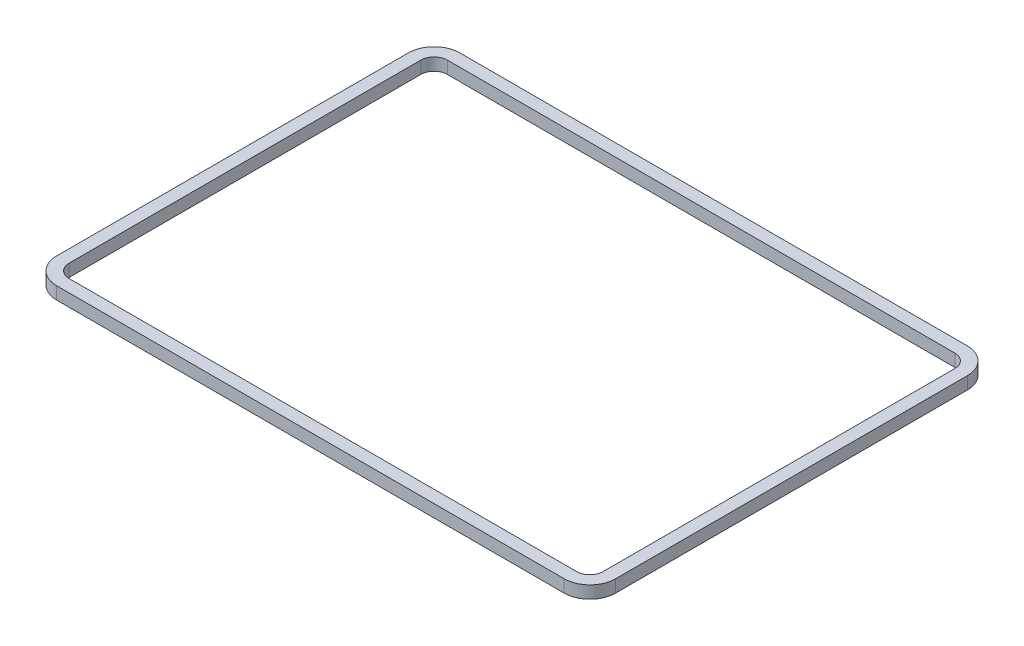
ISO-10303-21;
HEADER;
FILE_DESCRIPTION(('STEP AP214'),'2;1');
FILE_NAME('part.step','',(''),(''),'','','');
FILE_SCHEMA(('AUTOMOTIVE_DESIGN { 1 0 10303 214 1 1 1 1 }'));
ENDSEC;
DATA;
#1=APPLICATION_CONTEXT('core data for automotive mechanical design processes');
#2=APPLICATION_PROTOCOL_DEFINITION('international standard','automotive_design',2000,#1);
#3=PRODUCT_CONTEXT('',#1,'mechanical');
#4=PRODUCT('Part','Part','',(#3));
#5=PRODUCT_RELATED_PRODUCT_CATEGORY('part','',(#4));
#6=PRODUCT_DEFINITION_FORMATION('','',#4);
#7=PRODUCT_DEFINITION_CONTEXT('part definition',#1,'design');
#8=PRODUCT_DEFINITION('design','',#6,#7);
#9=PRODUCT_DEFINITION_SHAPE('','',#8);
#10=(LENGTH_UNIT() NAMED_UNIT(*) SI_UNIT(.MILLI.,.METRE.));
#11=(NAMED_UNIT(*) PLANE_ANGLE_UNIT() SI_UNIT($,.RADIAN.));
#12=(NAMED_UNIT(*) SI_UNIT($,.STERADIAN.) SOLID_ANGLE_UNIT());
#13=UNCERTAINTY_MEASURE_WITH_UNIT(LENGTH_MEASURE(1.E-05),#10,'distance_accuracy_value','');
#14=(GEOMETRIC_REPRESENTATION_CONTEXT(3) GLOBAL_UNCERTAINTY_ASSIGNED_CONTEXT((#13)) GLOBAL_UNIT_ASSIGNED_CONTEXT((#10,
#11,#12)) REPRESENTATION_CONTEXT('',''));
#15=CARTESIAN_POINT('',(0.,0.,0.));
#16=DIRECTION('',(0.,0.,1.));
#17=DIRECTION('',(1.,0.,0.));
#18=AXIS2_PLACEMENT_3D('',#15,#16,#17);
#19=CARTESIAN_POINT('',(-113.919,5.08,82.169));
#20=DIRECTION('',(0.,1.,0.));
#21=DIRECTION('',(0.,0.,1.));
#22=AXIS2_PLACEMENT_3D('',#19,#20,#21);
#23=PLANE('',#22);
#24=DIRECTION('',(-1.,0.,0.));
#25=VECTOR('',#24,1.);
#26=CARTESIAN_POINT('',(-113.919,5.08,-82.169));
#27=LINE('',#26,#25);
#28=CARTESIAN_POINT('',(103.4288,5.08,-82.169));
#29=VERTEX_POINT('',#28);
#30=CARTESIAN_POINT('',(-103.4288,5.08,-82.169));
#31=VERTEX_POINT('',#30);
#32=EDGE_CURVE('E172',#29,#31,#27,.T.);
#33=ORIENTED_EDGE('',*,*,#32,.T.);
#34=CARTESIAN_POINT('',(-103.4288,5.08,-71.6788));
#35=DIRECTION('',(0.,1.,0.));
#36=DIRECTION('',(0.,0.,1.));
#37=AXIS2_PLACEMENT_3D('',#34,#35,#36);
#38=CIRCLE('',#37,10.4902);
#39=CARTESIAN_POINT('',(-113.919,5.08,-71.6788));
#40=VERTEX_POINT('',#39);
#41=EDGE_CURVE('E229',#31,#40,#38,.T.);
#42=ORIENTED_EDGE('',*,*,#41,.T.);
#43=DIRECTION('',(0.,0.,1.));
#44=VECTOR('',#43,1.);
#45=CARTESIAN_POINT('',(-113.919,5.08,-82.169));
#46=LINE('',#45,#44);
#47=CARTESIAN_POINT('',(-113.919,5.08,71.6788));
#48=VERTEX_POINT('',#47);
#49=EDGE_CURVE('E261',#40,#48,#46,.T.);
#50=ORIENTED_EDGE('',*,*,#49,.T.);
#51=CARTESIAN_POINT('',(-103.4288,5.08,71.6788));
#52=DIRECTION('',(0.,1.,0.));
#53=DIRECTION('',(0.,0.,1.));
#54=AXIS2_PLACEMENT_3D('',#51,#52,#53);
#55=CIRCLE('',#54,10.4902);
#56=CARTESIAN_POINT('',(-103.4288,5.08,82.169));
#57=VERTEX_POINT('',#56);
#58=EDGE_CURVE('E227',#48,#57,#55,.T.);
#59=ORIENTED_EDGE('',*,*,#58,.T.);
#60=DIRECTION('',(1.,0.,0.));
#61=VECTOR('',#60,1.);
#62=CARTESIAN_POINT('',(-113.919,5.08,82.169));
#63=LINE('',#62,#61);
#64=CARTESIAN_POINT('',(103.4288,5.08,82.169));
#65=VERTEX_POINT('',#64);
#66=EDGE_CURVE('E243',#57,#65,#63,.T.);
#67=ORIENTED_EDGE('',*,*,#66,.T.);
#68=CARTESIAN_POINT('',(103.4288,5.08,71.6788));
#69=DIRECTION('',(0.,1.,0.));
#70=DIRECTION('',(0.,0.,1.));
#71=AXIS2_PLACEMENT_3D('',#68,#69,#70);
#72=CIRCLE('',#71,10.4902);
#73=CARTESIAN_POINT('',(113.919,5.08,71.6788));
#74=VERTEX_POINT('',#73);
#75=EDGE_CURVE('E53',#65,#74,#72,.T.);
#76=ORIENTED_EDGE('',*,*,#75,.T.);
#77=DIRECTION('',(0.,0.,-1.));
#78=VECTOR('',#77,1.);
#79=CARTESIAN_POINT('',(113.919,5.08,-82.169));
#80=LINE('',#79,#78);
#81=CARTESIAN_POINT('',(113.919,5.08,-71.6788));
#82=VERTEX_POINT('',#81);
#83=EDGE_CURVE('E177',#74,#82,#80,.T.);
#84=ORIENTED_EDGE('',*,*,#83,.T.);
#85=CARTESIAN_POINT('',(103.4288,5.08,-71.6788));
#86=DIRECTION('',(0.,1.,0.));
#87=DIRECTION('',(0.,0.,1.));
#88=AXIS2_PLACEMENT_3D('',#85,#86,#87);
#89=CIRCLE('',#88,10.4902);
#90=EDGE_CURVE('E224',#82,#29,#89,.T.);
#91=ORIENTED_EDGE('',*,*,#90,.T.);
#92=EDGE_LOOP('',(#33,#42,#50,#59,#67,#76,#84,#91));
#93=FACE_BOUND('',#92,.T.);
#94=DIRECTION('',(1.,0.,0.));
#95=VECTOR('',#94,1.);
#96=CARTESIAN_POINT('',(-108.839,5.08,77.089));
#97=LINE('',#96,#95);
#98=CARTESIAN_POINT('',(-103.4288,5.08,77.089));
#99=VERTEX_POINT('',#98);
#100=CARTESIAN_POINT('',(103.4288,5.08,77.089));
#101=VERTEX_POINT('',#100);
#102=EDGE_CURVE('E448',#99,#101,#97,.T.);
#103=ORIENTED_EDGE('',*,*,#102,.F.);
#104=CARTESIAN_POINT('',(-103.4288,5.08,71.6788));
#105=DIRECTION('',(0.,1.,0.));
#106=DIRECTION('',(0.,0.,1.));
#107=AXIS2_PLACEMENT_3D('',#104,#105,#106);
#108=CIRCLE('',#107,5.4102);
#109=CARTESIAN_POINT('',(-108.839,5.08,71.6788));
#110=VERTEX_POINT('',#109);
#111=EDGE_CURVE('E200',#99,#110,#108,.F.);
#112=ORIENTED_EDGE('',*,*,#111,.T.);
#113=DIRECTION('',(0.,0.,1.));
#114=VECTOR('',#113,1.);
#115=CARTESIAN_POINT('',(-108.839,5.08,-77.089));
#116=LINE('',#115,#114);
#117=CARTESIAN_POINT('',(-108.839,5.08,-71.6788));
#118=VERTEX_POINT('',#117);
#119=EDGE_CURVE('E442',#118,#110,#116,.T.);
#120=ORIENTED_EDGE('',*,*,#119,.F.);
#121=CARTESIAN_POINT('',(-103.4288,5.08,-71.6788));
#122=DIRECTION('',(0.,1.,0.));
#123=DIRECTION('',(0.,0.,1.));
#124=AXIS2_PLACEMENT_3D('',#121,#122,#123);
#125=CIRCLE('',#124,5.4102);
#126=CARTESIAN_POINT('',(-103.4288,5.08,-77.089));
#127=VERTEX_POINT('',#126);
#128=EDGE_CURVE('E204',#118,#127,#125,.F.);
#129=ORIENTED_EDGE('',*,*,#128,.T.);
#130=DIRECTION('',(-1.,0.,0.));
#131=VECTOR('',#130,1.);
#132=CARTESIAN_POINT('',(-108.839,5.08,-77.089));
#133=LINE('',#132,#131);
#134=CARTESIAN_POINT('',(103.4288,5.08,-77.089));
#135=VERTEX_POINT('',#134);
#136=EDGE_CURVE('E255',#135,#127,#133,.T.);
#137=ORIENTED_EDGE('',*,*,#136,.F.);
#138=CARTESIAN_POINT('',(103.4288,5.08,-71.6788));
#139=DIRECTION('',(0.,1.,0.));
#140=DIRECTION('',(0.,0.,1.));
#141=AXIS2_PLACEMENT_3D('',#138,#139,#140);
#142=CIRCLE('',#141,5.4102);
#143=CARTESIAN_POINT('',(108.839,5.08,-71.6788));
#144=VERTEX_POINT('',#143);
#145=EDGE_CURVE('E158',#135,#144,#142,.F.);
#146=ORIENTED_EDGE('',*,*,#145,.T.);
#147=DIRECTION('',(0.,0.,-1.));
#148=VECTOR('',#147,1.);
#149=CARTESIAN_POINT('',(108.839,5.08,-77.089));
#150=LINE('',#149,#148);
#151=CARTESIAN_POINT('',(108.839,5.08,71.6788));
#152=VERTEX_POINT('',#151);
#153=EDGE_CURVE('E460',#152,#144,#150,.T.);
#154=ORIENTED_EDGE('',*,*,#153,.F.);
#155=CARTESIAN_POINT('',(103.4288,5.08,71.6788));
#156=DIRECTION('',(0.,1.,0.));
#157=DIRECTION('',(0.,0.,1.));
#158=AXIS2_PLACEMENT_3D('',#155,#156,#157);
#159=CIRCLE('',#158,5.4102);
#160=EDGE_CURVE('E157',#152,#101,#159,.F.);
#161=ORIENTED_EDGE('',*,*,#160,.T.);
#162=EDGE_LOOP('',(#103,#112,#120,#129,#137,#146,#154,#161));
#163=FACE_BOUND('',#162,.T.);
#164=ADVANCED_FACE('F32',(#93,#163),#23,.T.);
#165=CARTESIAN_POINT('',(-113.919,0.,82.169));
#166=DIRECTION('',(0.,1.,0.));
#167=DIRECTION('',(0.,0.,1.));
#168=AXIS2_PLACEMENT_3D('',#165,#166,#167);
#169=PLANE('',#168);
#170=DIRECTION('',(0.,0.,1.));
#171=VECTOR('',#170,1.);
#172=CARTESIAN_POINT('',(-113.919,0.,-82.169));
#173=LINE('',#172,#171);
#174=CARTESIAN_POINT('',(-113.919,0.,-71.6788));
#175=VERTEX_POINT('',#174);
#176=CARTESIAN_POINT('',(-113.919,0.,71.6788));
#177=VERTEX_POINT('',#176);
#178=EDGE_CURVE('E251',#175,#177,#173,.T.);
#179=ORIENTED_EDGE('',*,*,#178,.F.);
#180=CARTESIAN_POINT('',(-103.4288,0.,-71.6788));
#181=DIRECTION('',(0.,1.,0.));
#182=DIRECTION('',(0.,0.,1.));
#183=AXIS2_PLACEMENT_3D('',#180,#181,#182);
#184=CIRCLE('',#183,10.4902);
#185=CARTESIAN_POINT('',(-103.4288,0.,-82.169));
#186=VERTEX_POINT('',#185);
#187=EDGE_CURVE('E217',#175,#186,#184,.F.);
#188=ORIENTED_EDGE('',*,*,#187,.T.);
#189=DIRECTION('',(-1.,0.,0.));
#190=VECTOR('',#189,1.);
#191=CARTESIAN_POINT('',(-113.919,0.,-82.169));
#192=LINE('',#191,#190);
#193=CARTESIAN_POINT('',(103.4288,0.,-82.169));
#194=VERTEX_POINT('',#193);
#195=EDGE_CURVE('E253',#194,#186,#192,.T.);
#196=ORIENTED_EDGE('',*,*,#195,.F.);
#197=CARTESIAN_POINT('',(103.4288,0.,-71.6788));
#198=DIRECTION('',(0.,1.,0.));
#199=DIRECTION('',(0.,0.,1.));
#200=AXIS2_PLACEMENT_3D('',#197,#198,#199);
#201=CIRCLE('',#200,10.4902);
#202=CARTESIAN_POINT('',(113.919,0.,-71.6788));
#203=VERTEX_POINT('',#202);
#204=EDGE_CURVE('E211',#194,#203,#201,.F.);
#205=ORIENTED_EDGE('',*,*,#204,.T.);
#206=DIRECTION('',(0.,0.,-1.));
#207=VECTOR('',#206,1.);
#208=CARTESIAN_POINT('',(113.919,0.,-82.169));
#209=LINE('',#208,#207);
#210=CARTESIAN_POINT('',(113.919,0.,71.6788));
#211=VERTEX_POINT('',#210);
#212=EDGE_CURVE('E250',#211,#203,#209,.T.);
#213=ORIENTED_EDGE('',*,*,#212,.F.);
#214=CARTESIAN_POINT('',(103.4288,0.,71.6788));
#215=DIRECTION('',(0.,1.,0.));
#216=DIRECTION('',(0.,0.,1.));
#217=AXIS2_PLACEMENT_3D('',#214,#215,#216);
#218=CIRCLE('',#217,10.4902);
#219=CARTESIAN_POINT('',(103.4288,0.,82.169));
#220=VERTEX_POINT('',#219);
#221=EDGE_CURVE('E213',#211,#220,#218,.F.);
#222=ORIENTED_EDGE('',*,*,#221,.T.);
#223=DIRECTION('',(1.,0.,0.));
#224=VECTOR('',#223,1.);
#225=CARTESIAN_POINT('',(-113.919,0.,82.169));
#226=LINE('',#225,#224);
#227=CARTESIAN_POINT('',(-103.4288,0.,82.169));
#228=VERTEX_POINT('',#227);
#229=EDGE_CURVE('E241',#228,#220,#226,.T.);
#230=ORIENTED_EDGE('',*,*,#229,.F.);
#231=CARTESIAN_POINT('',(-103.4288,0.,71.6788));
#232=DIRECTION('',(0.,1.,0.));
#233=DIRECTION('',(0.,0.,1.));
#234=AXIS2_PLACEMENT_3D('',#231,#232,#233);
#235=CIRCLE('',#234,10.4902);
#236=EDGE_CURVE('E215',#228,#177,#235,.F.);
#237=ORIENTED_EDGE('',*,*,#236,.T.);
#238=EDGE_LOOP('',(#179,#188,#196,#205,#213,#222,#230,#237));
#239=FACE_BOUND('',#238,.T.);
#240=DIRECTION('',(-1.,0.,0.));
#241=VECTOR('',#240,1.);
#242=CARTESIAN_POINT('',(-108.839,0.,-77.089));
#243=LINE('',#242,#241);
#244=CARTESIAN_POINT('',(103.4288,0.,-77.089));
#245=VERTEX_POINT('',#244);
#246=CARTESIAN_POINT('',(-103.4288,0.,-77.089));
#247=VERTEX_POINT('',#246);
#248=EDGE_CURVE('E168',#245,#247,#243,.T.);
#249=ORIENTED_EDGE('',*,*,#248,.T.);
#250=CARTESIAN_POINT('',(-103.4288,0.,-71.6788));
#251=DIRECTION('',(0.,1.,0.));
#252=DIRECTION('',(0.,0.,1.));
#253=AXIS2_PLACEMENT_3D('',#250,#251,#252);
#254=CIRCLE('',#253,5.4102);
#255=CARTESIAN_POINT('',(-108.839,0.,-71.6788));
#256=VERTEX_POINT('',#255);
#257=EDGE_CURVE('E202',#247,#256,#254,.T.);
#258=ORIENTED_EDGE('',*,*,#257,.T.);
#259=DIRECTION('',(0.,0.,1.));
#260=VECTOR('',#259,1.);
#261=CARTESIAN_POINT('',(-108.839,0.,-77.089));
#262=LINE('',#261,#260);
#263=CARTESIAN_POINT('',(-108.839,0.,71.6788));
#264=VERTEX_POINT('',#263);
#265=EDGE_CURVE('E452',#256,#264,#262,.T.);
#266=ORIENTED_EDGE('',*,*,#265,.T.);
#267=CARTESIAN_POINT('',(-103.4288,0.,71.6788));
#268=DIRECTION('',(0.,1.,0.));
#269=DIRECTION('',(0.,0.,1.));
#270=AXIS2_PLACEMENT_3D('',#267,#268,#269);
#271=CIRCLE('',#270,5.4102);
#272=CARTESIAN_POINT('',(-103.4288,0.,77.089));
#273=VERTEX_POINT('',#272);
#274=EDGE_CURVE('E198',#264,#273,#271,.T.);
#275=ORIENTED_EDGE('',*,*,#274,.T.);
#276=DIRECTION('',(1.,0.,0.));
#277=VECTOR('',#276,1.);
#278=CARTESIAN_POINT('',(-108.839,0.,77.089));
#279=LINE('',#278,#277);
#280=CARTESIAN_POINT('',(103.4288,0.,77.089));
#281=VERTEX_POINT('',#280);
#282=EDGE_CURVE('E152',#273,#281,#279,.T.);
#283=ORIENTED_EDGE('',*,*,#282,.T.);
#284=CARTESIAN_POINT('',(103.4288,0.,71.6788));
#285=DIRECTION('',(0.,1.,0.));
#286=DIRECTION('',(0.,0.,1.));
#287=AXIS2_PLACEMENT_3D('',#284,#285,#286);
#288=CIRCLE('',#287,5.4102);
#289=CARTESIAN_POINT('',(108.839,0.,71.6788));
#290=VERTEX_POINT('',#289);
#291=EDGE_CURVE('E146',#281,#290,#288,.T.);
#292=ORIENTED_EDGE('',*,*,#291,.T.);
#293=DIRECTION('',(0.,0.,-1.));
#294=VECTOR('',#293,1.);
#295=CARTESIAN_POINT('',(108.839,0.,-77.089));
#296=LINE('',#295,#294);
#297=CARTESIAN_POINT('',(108.839,0.,-71.6788));
#298=VERTEX_POINT('',#297);
#299=EDGE_CURVE('E150',#290,#298,#296,.T.);
#300=ORIENTED_EDGE('',*,*,#299,.T.);
#301=CARTESIAN_POINT('',(103.4288,0.,-71.6788));
#302=DIRECTION('',(0.,1.,0.));
#303=DIRECTION('',(0.,0.,1.));
#304=AXIS2_PLACEMENT_3D('',#301,#302,#303);
#305=CIRCLE('',#304,5.4102);
#306=EDGE_CURVE('E194',#298,#245,#305,.T.);
#307=ORIENTED_EDGE('',*,*,#306,.T.);
#308=EDGE_LOOP('',(#249,#258,#266,#275,#283,#292,#300,#307));
#309=FACE_BOUND('',#308,.T.);
#310=ADVANCED_FACE('F149',(#239,#309),#169,.F.);
#311=CARTESIAN_POINT('',(-113.919,5.08,-82.169));
#312=DIRECTION('',(1.,0.,0.));
#313=DIRECTION('',(0.,0.,-1.));
#314=AXIS2_PLACEMENT_3D('',#311,#312,#313);
#315=PLANE('',#314);
#316=ORIENTED_EDGE('',*,*,#49,.F.);
#317=DIRECTION('',(0.,-1.,0.));
#318=VECTOR('',#317,1.);
#319=CARTESIAN_POINT('',(-113.919,5.08,-71.6788));
#320=LINE('',#319,#318);
#321=EDGE_CURVE('E208',#40,#175,#320,.T.);
#322=ORIENTED_EDGE('',*,*,#321,.T.);
#323=ORIENTED_EDGE('',*,*,#178,.T.);
#324=DIRECTION('',(0.,-1.,0.));
#325=VECTOR('',#324,1.);
#326=CARTESIAN_POINT('',(-113.919,5.08,71.6788));
#327=LINE('',#326,#325);
#328=EDGE_CURVE('E206',#177,#48,#327,.F.);
#329=ORIENTED_EDGE('',*,*,#328,.T.);
#330=EDGE_LOOP('',(#316,#322,#323,#329));
#331=FACE_BOUND('',#330,.T.);
#332=ADVANCED_FACE('F34',(#331),#315,.F.);
#333=CARTESIAN_POINT('',(-113.919,5.08,82.169));
#334=DIRECTION('',(0.,0.,-1.));
#335=DIRECTION('',(-1.,0.,0.));
#336=AXIS2_PLACEMENT_3D('',#333,#334,#335);
#337=PLANE('',#336);
#338=ORIENTED_EDGE('',*,*,#66,.F.);
#339=DIRECTION('',(0.,-1.,0.));
#340=VECTOR('',#339,1.);
#341=CARTESIAN_POINT('',(-103.4288,5.08,82.169));
#342=LINE('',#341,#340);
#343=EDGE_CURVE('E233',#57,#228,#342,.T.);
#344=ORIENTED_EDGE('',*,*,#343,.T.);
#345=ORIENTED_EDGE('',*,*,#229,.T.);
#346=DIRECTION('',(0.,-1.,0.));
#347=VECTOR('',#346,1.);
#348=CARTESIAN_POINT('',(103.4288,5.08,82.169));
#349=LINE('',#348,#347);
#350=EDGE_CURVE('E231',#220,#65,#349,.F.);
#351=ORIENTED_EDGE('',*,*,#350,.T.);
#352=EDGE_LOOP('',(#338,#344,#345,#351));
#353=FACE_BOUND('',#352,.T.);
#354=ADVANCED_FACE('F240',(#353),#337,.F.);
#355=CARTESIAN_POINT('',(113.919,5.08,-82.169));
#356=DIRECTION('',(-1.,0.,0.));
#357=DIRECTION('',(0.,0.,1.));
#358=AXIS2_PLACEMENT_3D('',#355,#356,#357);
#359=PLANE('',#358);
#360=ORIENTED_EDGE('',*,*,#83,.F.);
#361=DIRECTION('',(0.,-1.,0.));
#362=VECTOR('',#361,1.);
#363=CARTESIAN_POINT('',(113.919,5.08,71.6788));
#364=LINE('',#363,#362);
#365=EDGE_CURVE('E11',#74,#211,#364,.T.);
#366=ORIENTED_EDGE('',*,*,#365,.T.);
#367=ORIENTED_EDGE('',*,*,#212,.T.);
#368=DIRECTION('',(0.,-1.,0.));
#369=VECTOR('',#368,1.);
#370=CARTESIAN_POINT('',(113.919,5.08,-71.6788));
#371=LINE('',#370,#369);
#372=EDGE_CURVE('E40',#203,#82,#371,.F.);
#373=ORIENTED_EDGE('',*,*,#372,.T.);
#374=EDGE_LOOP('',(#360,#366,#367,#373));
#375=FACE_BOUND('',#374,.T.);
#376=ADVANCED_FACE('F305',(#375),#359,.F.);
#377=CARTESIAN_POINT('',(-113.919,5.08,-82.169));
#378=DIRECTION('',(0.,0.,1.));
#379=DIRECTION('',(1.,0.,0.));
#380=AXIS2_PLACEMENT_3D('',#377,#378,#379);
#381=PLANE('',#380);
#382=ORIENTED_EDGE('',*,*,#195,.T.);
#383=DIRECTION('',(0.,-1.,0.));
#384=VECTOR('',#383,1.);
#385=CARTESIAN_POINT('',(-103.4288,5.08,-82.169));
#386=LINE('',#385,#384);
#387=EDGE_CURVE('E222',#186,#31,#386,.F.);
#388=ORIENTED_EDGE('',*,*,#387,.T.);
#389=ORIENTED_EDGE('',*,*,#32,.F.);
#390=DIRECTION('',(0.,-1.,0.));
#391=VECTOR('',#390,1.);
#392=CARTESIAN_POINT('',(103.4288,5.08,-82.169));
#393=LINE('',#392,#391);
#394=EDGE_CURVE('E219',#29,#194,#393,.T.);
#395=ORIENTED_EDGE('',*,*,#394,.T.);
#396=EDGE_LOOP('',(#382,#388,#389,#395));
#397=FACE_BOUND('',#396,.T.);
#398=ADVANCED_FACE('F273',(#397),#381,.F.);
#399=CARTESIAN_POINT('',(-108.839,5.08,-77.089));
#400=DIRECTION('',(1.,0.,0.));
#401=DIRECTION('',(0.,0.,-1.));
#402=AXIS2_PLACEMENT_3D('',#399,#400,#401);
#403=PLANE('',#402);
#404=ORIENTED_EDGE('',*,*,#119,.T.);
#405=DIRECTION('',(0.,-1.,0.));
#406=VECTOR('',#405,1.);
#407=CARTESIAN_POINT('',(-108.839,0.,71.6788));
#408=LINE('',#407,#406);
#409=EDGE_CURVE('E191',#110,#264,#408,.T.);
#410=ORIENTED_EDGE('',*,*,#409,.T.);
#411=ORIENTED_EDGE('',*,*,#265,.F.);
#412=DIRECTION('',(0.,-1.,0.));
#413=VECTOR('',#412,1.);
#414=CARTESIAN_POINT('',(-108.839,5.08,-71.6788));
#415=LINE('',#414,#413);
#416=EDGE_CURVE('E189',#256,#118,#415,.F.);
#417=ORIENTED_EDGE('',*,*,#416,.T.);
#418=EDGE_LOOP('',(#404,#410,#411,#417));
#419=FACE_BOUND('',#418,.T.);
#420=ADVANCED_FACE('F304',(#419),#403,.T.);
#421=CARTESIAN_POINT('',(-108.839,5.08,77.089));
#422=DIRECTION('',(0.,0.,-1.));
#423=DIRECTION('',(-1.,0.,0.));
#424=AXIS2_PLACEMENT_3D('',#421,#422,#423);
#425=PLANE('',#424);
#426=ORIENTED_EDGE('',*,*,#102,.T.);
#427=DIRECTION('',(0.,-1.,0.));
#428=VECTOR('',#427,1.);
#429=CARTESIAN_POINT('',(103.4288,0.,77.089));
#430=LINE('',#429,#428);
#431=EDGE_CURVE('E187',#101,#281,#430,.T.);
#432=ORIENTED_EDGE('',*,*,#431,.T.);
#433=ORIENTED_EDGE('',*,*,#282,.F.);
#434=DIRECTION('',(0.,-1.,0.));
#435=VECTOR('',#434,1.);
#436=CARTESIAN_POINT('',(-103.4288,5.08,77.089));
#437=LINE('',#436,#435);
#438=EDGE_CURVE('E185',#273,#99,#437,.F.);
#439=ORIENTED_EDGE('',*,*,#438,.T.);
#440=EDGE_LOOP('',(#426,#432,#433,#439));
#441=FACE_BOUND('',#440,.T.);
#442=ADVANCED_FACE('F378',(#441),#425,.T.);
#443=CARTESIAN_POINT('',(108.839,5.08,-77.089));
#444=DIRECTION('',(-1.,0.,0.));
#445=DIRECTION('',(0.,0.,1.));
#446=AXIS2_PLACEMENT_3D('',#443,#444,#445);
#447=PLANE('',#446);
#448=ORIENTED_EDGE('',*,*,#153,.T.);
#449=DIRECTION('',(0.,-1.,0.));
#450=VECTOR('',#449,1.);
#451=CARTESIAN_POINT('',(108.839,0.,-71.6788));
#452=LINE('',#451,#450);
#453=EDGE_CURVE('E167',#144,#298,#452,.T.);
#454=ORIENTED_EDGE('',*,*,#453,.T.);
#455=ORIENTED_EDGE('',*,*,#299,.F.);
#456=DIRECTION('',(0.,-1.,0.));
#457=VECTOR('',#456,1.);
#458=CARTESIAN_POINT('',(108.839,5.08,71.6788));
#459=LINE('',#458,#457);
#460=EDGE_CURVE('E164',#290,#152,#459,.F.);
#461=ORIENTED_EDGE('',*,*,#460,.T.);
#462=EDGE_LOOP('',(#448,#454,#455,#461));
#463=FACE_BOUND('',#462,.T.);
#464=ADVANCED_FACE('F163',(#463),#447,.T.);
#465=CARTESIAN_POINT('',(-108.839,5.08,-77.089));
#466=DIRECTION('',(0.,0.,1.));
#467=DIRECTION('',(1.,0.,0.));
#468=AXIS2_PLACEMENT_3D('',#465,#466,#467);
#469=PLANE('',#468);
#470=ORIENTED_EDGE('',*,*,#248,.F.);
#471=DIRECTION('',(0.,-1.,0.));
#472=VECTOR('',#471,1.);
#473=CARTESIAN_POINT('',(103.4288,5.08,-77.089));
#474=LINE('',#473,#472);
#475=EDGE_CURVE('E183',#245,#135,#474,.F.);
#476=ORIENTED_EDGE('',*,*,#475,.T.);
#477=ORIENTED_EDGE('',*,*,#136,.T.);
#478=DIRECTION('',(0.,-1.,0.));
#479=VECTOR('',#478,1.);
#480=CARTESIAN_POINT('',(-103.4288,0.,-77.089));
#481=LINE('',#480,#479);
#482=EDGE_CURVE('E174',#127,#247,#481,.T.);
#483=ORIENTED_EDGE('',*,*,#482,.T.);
#484=EDGE_LOOP('',(#470,#476,#477,#483));
#485=FACE_BOUND('',#484,.T.);
#486=ADVANCED_FACE('F359',(#485),#469,.T.);
#487=CARTESIAN_POINT('',(103.4288,5.08,-71.6788));
#488=DIRECTION('',(0.,1.,0.));
#489=DIRECTION('',(0.,0.,1.));
#490=AXIS2_PLACEMENT_3D('',#487,#488,#489);
#491=CYLINDRICAL_SURFACE('',#490,5.4102);
#492=ORIENTED_EDGE('',*,*,#145,.F.);
#493=ORIENTED_EDGE('',*,*,#475,.F.);
#494=ORIENTED_EDGE('',*,*,#306,.F.);
#495=ORIENTED_EDGE('',*,*,#453,.F.);
#496=EDGE_LOOP('',(#492,#493,#494,#495));
#497=FACE_BOUND('',#496,.T.);
#498=ADVANCED_FACE('F350',(#497),#491,.F.);
#499=CARTESIAN_POINT('',(103.4288,5.08,71.6788));
#500=DIRECTION('',(0.,1.,0.));
#501=DIRECTION('',(0.,0.,1.));
#502=AXIS2_PLACEMENT_3D('',#499,#500,#501);
#503=CYLINDRICAL_SURFACE('',#502,5.4102);
#504=ORIENTED_EDGE('',*,*,#160,.F.);
#505=ORIENTED_EDGE('',*,*,#460,.F.);
#506=ORIENTED_EDGE('',*,*,#291,.F.);
#507=ORIENTED_EDGE('',*,*,#431,.F.);
#508=EDGE_LOOP('',(#504,#505,#506,#507));
#509=FACE_BOUND('',#508,.T.);
#510=ADVANCED_FACE('F171',(#509),#503,.F.);
#511=CARTESIAN_POINT('',(-103.4288,5.08,71.6788));
#512=DIRECTION('',(0.,1.,0.));
#513=DIRECTION('',(0.,0.,1.));
#514=AXIS2_PLACEMENT_3D('',#511,#512,#513);
#515=CYLINDRICAL_SURFACE('',#514,5.4102);
#516=ORIENTED_EDGE('',*,*,#111,.F.);
#517=ORIENTED_EDGE('',*,*,#438,.F.);
#518=ORIENTED_EDGE('',*,*,#274,.F.);
#519=ORIENTED_EDGE('',*,*,#409,.F.);
#520=EDGE_LOOP('',(#516,#517,#518,#519));
#521=FACE_BOUND('',#520,.T.);
#522=ADVANCED_FACE('F330',(#521),#515,.F.);
#523=CARTESIAN_POINT('',(-103.4288,5.08,-71.6788));
#524=DIRECTION('',(0.,1.,0.));
#525=DIRECTION('',(0.,0.,1.));
#526=AXIS2_PLACEMENT_3D('',#523,#524,#525);
#527=CYLINDRICAL_SURFACE('',#526,5.4102);
#528=ORIENTED_EDGE('',*,*,#128,.F.);
#529=ORIENTED_EDGE('',*,*,#416,.F.);
#530=ORIENTED_EDGE('',*,*,#257,.F.);
#531=ORIENTED_EDGE('',*,*,#482,.F.);
#532=EDGE_LOOP('',(#528,#529,#530,#531));
#533=FACE_BOUND('',#532,.T.);
#534=ADVANCED_FACE('F292',(#533),#527,.F.);
#535=CARTESIAN_POINT('',(-103.4288,5.08,-71.6788));
#536=DIRECTION('',(0.,-1.,0.));
#537=DIRECTION('',(0.,0.,-1.));
#538=AXIS2_PLACEMENT_3D('',#535,#536,#537);
#539=CYLINDRICAL_SURFACE('',#538,10.4902);
#540=ORIENTED_EDGE('',*,*,#41,.F.);
#541=ORIENTED_EDGE('',*,*,#387,.F.);
#542=ORIENTED_EDGE('',*,*,#187,.F.);
#543=ORIENTED_EDGE('',*,*,#321,.F.);
#544=EDGE_LOOP('',(#540,#541,#542,#543));
#545=FACE_BOUND('',#544,.T.);
#546=ADVANCED_FACE('F278',(#545),#539,.T.);
#547=CARTESIAN_POINT('',(-103.4288,5.08,71.6788));
#548=DIRECTION('',(0.,-1.,0.));
#549=DIRECTION('',(0.,0.,-1.));
#550=AXIS2_PLACEMENT_3D('',#547,#548,#549);
#551=CYLINDRICAL_SURFACE('',#550,10.4902);
#552=ORIENTED_EDGE('',*,*,#58,.F.);
#553=ORIENTED_EDGE('',*,*,#328,.F.);
#554=ORIENTED_EDGE('',*,*,#236,.F.);
#555=ORIENTED_EDGE('',*,*,#343,.F.);
#556=EDGE_LOOP('',(#552,#553,#554,#555));
#557=FACE_BOUND('',#556,.T.);
#558=ADVANCED_FACE('F282',(#557),#551,.T.);
#559=CARTESIAN_POINT('',(103.4288,5.08,71.6788));
#560=DIRECTION('',(0.,-1.,0.));
#561=DIRECTION('',(0.,0.,-1.));
#562=AXIS2_PLACEMENT_3D('',#559,#560,#561);
#563=CYLINDRICAL_SURFACE('',#562,10.4902);
#564=ORIENTED_EDGE('',*,*,#75,.F.);
#565=ORIENTED_EDGE('',*,*,#350,.F.);
#566=ORIENTED_EDGE('',*,*,#221,.F.);
#567=ORIENTED_EDGE('',*,*,#365,.F.);
#568=EDGE_LOOP('',(#564,#565,#566,#567));
#569=FACE_BOUND('',#568,.T.);
#570=ADVANCED_FACE('F284',(#569),#563,.T.);
#571=CARTESIAN_POINT('',(103.4288,5.08,-71.6788));
#572=DIRECTION('',(0.,-1.,0.));
#573=DIRECTION('',(0.,0.,-1.));
#574=AXIS2_PLACEMENT_3D('',#571,#572,#573);
#575=CYLINDRICAL_SURFACE('',#574,10.4902);
#576=ORIENTED_EDGE('',*,*,#90,.F.);
#577=ORIENTED_EDGE('',*,*,#372,.F.);
#578=ORIENTED_EDGE('',*,*,#204,.F.);
#579=ORIENTED_EDGE('',*,*,#394,.F.);
#580=EDGE_LOOP('',(#576,#577,#578,#579));
#581=FACE_BOUND('',#580,.T.);
#582=ADVANCED_FACE('F270',(#581),#575,.T.);
#583=CLOSED_SHELL('',(#164,#310,#332,#354,#376,#398,#420,#442,#464,#486,#498,#510,#522,#534,
#546,#558,#570,#582));
#584=MANIFOLD_SOLID_BREP('B2',#583);
#585=ADVANCED_BREP_SHAPE_REPRESENTATION('',(#18,#584),#14);
#586=SHAPE_DEFINITION_REPRESENTATION(#9,#585);
ENDSEC;
END-ISO-10303-21;
